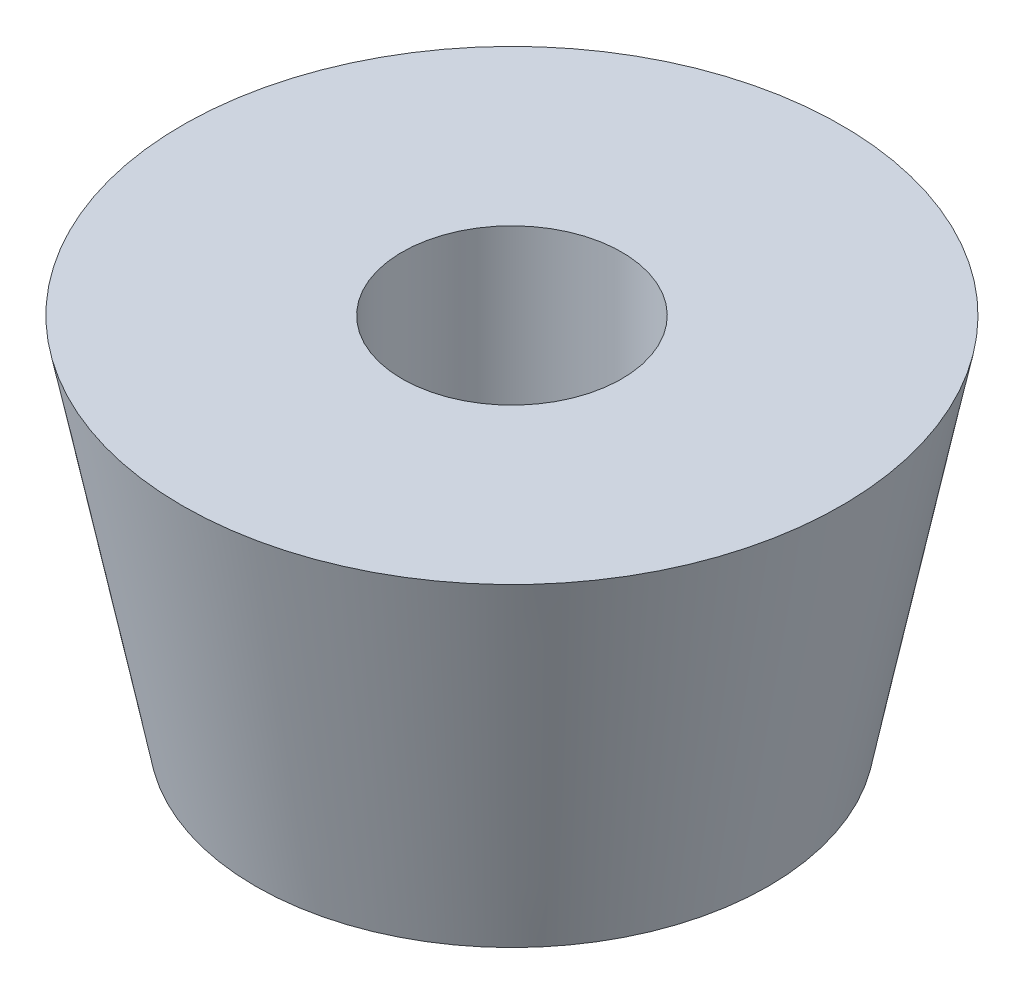
ISO-10303-21;
HEADER;
FILE_DESCRIPTION(('STEP AP214'),'2;1');
FILE_NAME('part.step','',(''),(''),'','','');
FILE_SCHEMA(('AUTOMOTIVE_DESIGN { 1 0 10303 214 1 1 1 1 }'));
ENDSEC;
DATA;
#1=APPLICATION_CONTEXT('core data for automotive mechanical design processes');
#2=APPLICATION_PROTOCOL_DEFINITION('international standard','automotive_design',2000,#1);
#3=PRODUCT_CONTEXT('',#1,'mechanical');
#4=PRODUCT('Part','Part','',(#3));
#5=PRODUCT_RELATED_PRODUCT_CATEGORY('part','',(#4));
#6=PRODUCT_DEFINITION_FORMATION('','',#4);
#7=PRODUCT_DEFINITION_CONTEXT('part definition',#1,'design');
#8=PRODUCT_DEFINITION('design','',#6,#7);
#9=PRODUCT_DEFINITION_SHAPE('','',#8);
#10=(LENGTH_UNIT() NAMED_UNIT(*) SI_UNIT(.MILLI.,.METRE.));
#11=(NAMED_UNIT(*) PLANE_ANGLE_UNIT() SI_UNIT($,.RADIAN.));
#12=(NAMED_UNIT(*) SI_UNIT($,.STERADIAN.) SOLID_ANGLE_UNIT());
#13=UNCERTAINTY_MEASURE_WITH_UNIT(LENGTH_MEASURE(1.E-05),#10,'distance_accuracy_value','');
#14=(GEOMETRIC_REPRESENTATION_CONTEXT(3) GLOBAL_UNCERTAINTY_ASSIGNED_CONTEXT((#13)) GLOBAL_UNIT_ASSIGNED_CONTEXT((#10,
#11,#12)) REPRESENTATION_CONTEXT('',''));
#15=CARTESIAN_POINT('',(0.,0.,0.));
#16=DIRECTION('',(0.,0.,1.));
#17=DIRECTION('',(1.,0.,0.));
#18=AXIS2_PLACEMENT_3D('',#15,#16,#17);
#19=CARTESIAN_POINT('',(0.,0.,-18.));
#20=DIRECTION('',(0.,-1.,0.));
#21=DIRECTION('',(0.,0.,-1.));
#22=AXIS2_PLACEMENT_3D('',#19,#20,#21);
#23=PLANE('',#22);
#24=CARTESIAN_POINT('',(0.,0.,0.));
#25=DIRECTION('',(0.,1.,0.));
#26=DIRECTION('',(0.,0.,1.));
#27=AXIS2_PLACEMENT_3D('',#24,#25,#26);
#28=CIRCLE('',#27,6.);
#29=CARTESIAN_POINT('',(0.,0.,6.));
#30=VERTEX_POINT('',#29);
#31=EDGE_CURVE('E10',#30,#30,#28,.T.);
#32=ORIENTED_EDGE('',*,*,#31,.F.);
#33=EDGE_LOOP('',(#32));
#34=FACE_BOUND('',#33,.T.);
#35=CARTESIAN_POINT('',(0.,0.,0.));
#36=DIRECTION('',(0.,1.,0.));
#37=DIRECTION('',(0.,0.,1.));
#38=AXIS2_PLACEMENT_3D('',#35,#36,#37);
#39=CIRCLE('',#38,18.);
#40=CARTESIAN_POINT('',(0.,0.,18.));
#41=VERTEX_POINT('',#40);
#42=EDGE_CURVE('E47',#41,#41,#39,.T.);
#43=ORIENTED_EDGE('',*,*,#42,.T.);
#44=EDGE_LOOP('',(#43));
#45=FACE_BOUND('',#44,.T.);
#46=ADVANCED_FACE('F33',(#34,#45),#23,.F.);
#47=CARTESIAN_POINT('',(0.,0.,0.));
#48=DIRECTION('',(0.,1.,0.));
#49=DIRECTION('',(0.,0.,1.));
#50=AXIS2_PLACEMENT_3D('',#47,#48,#49);
#51=CYLINDRICAL_SURFACE('',#50,6.);
#52=CARTESIAN_POINT('',(0.,-20.,0.));
#53=DIRECTION('',(0.,1.,0.));
#54=DIRECTION('',(0.,0.,1.));
#55=AXIS2_PLACEMENT_3D('',#52,#53,#54);
#56=CIRCLE('',#55,6.);
#57=CARTESIAN_POINT('',(0.,-20.,6.));
#58=VERTEX_POINT('',#57);
#59=EDGE_CURVE('E39',#58,#58,#56,.T.);
#60=ORIENTED_EDGE('',*,*,#59,.F.);
#61=EDGE_LOOP('',(#60));
#62=FACE_BOUND('',#61,.T.);
#63=ORIENTED_EDGE('',*,*,#31,.T.);
#64=EDGE_LOOP('',(#63));
#65=FACE_BOUND('',#64,.T.);
#66=ADVANCED_FACE('F62',(#62,#65),#51,.F.);
#67=CARTESIAN_POINT('',(0.,-20.,-6.));
#68=DIRECTION('',(0.,1.,0.));
#69=DIRECTION('',(0.,0.,1.));
#70=AXIS2_PLACEMENT_3D('',#67,#68,#69);
#71=PLANE('',#70);
#72=CARTESIAN_POINT('',(0.,-20.,0.));
#73=DIRECTION('',(0.,1.,0.));
#74=DIRECTION('',(0.,0.,1.));
#75=AXIS2_PLACEMENT_3D('',#72,#73,#74);
#76=CIRCLE('',#75,14.);
#77=CARTESIAN_POINT('',(0.,-20.,14.));
#78=VERTEX_POINT('',#77);
#79=EDGE_CURVE('E43',#78,#78,#76,.T.);
#80=ORIENTED_EDGE('',*,*,#79,.F.);
#81=EDGE_LOOP('',(#80));
#82=FACE_BOUND('',#81,.T.);
#83=ORIENTED_EDGE('',*,*,#59,.T.);
#84=EDGE_LOOP('',(#83));
#85=FACE_BOUND('',#84,.T.);
#86=ADVANCED_FACE('F57',(#82,#85),#71,.F.);
#87=CARTESIAN_POINT('',(0.,-20.,0.));
#88=DIRECTION('',(0.,1.,0.));
#89=DIRECTION('',(0.,0.,1.));
#90=AXIS2_PLACEMENT_3D('',#87,#88,#89);
#91=CONICAL_SURFACE('',#90,14.,0.197395559849881);
#92=ORIENTED_EDGE('',*,*,#42,.F.);
#93=EDGE_LOOP('',(#92));
#94=FACE_BOUND('',#93,.T.);
#95=ORIENTED_EDGE('',*,*,#79,.T.);
#96=EDGE_LOOP('',(#95));
#97=FACE_BOUND('',#96,.T.);
#98=ADVANCED_FACE('F54',(#94,#97),#91,.T.);
#99=CLOSED_SHELL('',(#46,#66,#86,#98));
#100=MANIFOLD_SOLID_BREP('B2',#99);
#101=ADVANCED_BREP_SHAPE_REPRESENTATION('',(#18,#100),#14);
#102=SHAPE_DEFINITION_REPRESENTATION(#9,#101);
ENDSEC;
END-ISO-10303-21;
